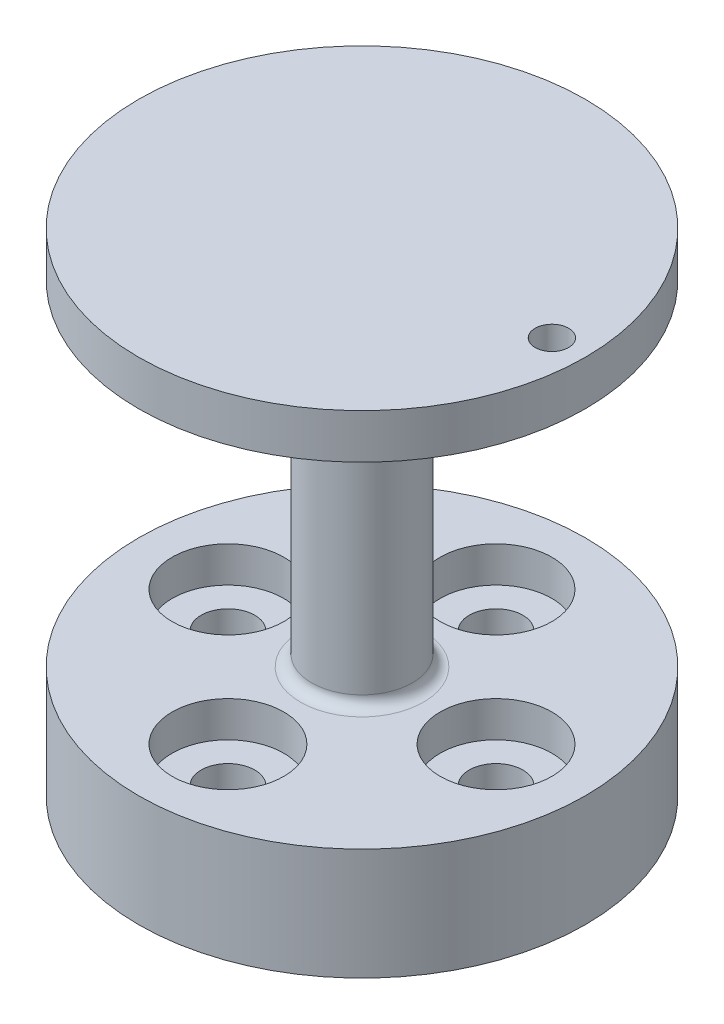
ISO-10303-21;
HEADER;
FILE_DESCRIPTION(('STEP AP214'),'2;1');
FILE_NAME('part.step','',(''),(''),'','','');
FILE_SCHEMA(('AUTOMOTIVE_DESIGN { 1 0 10303 214 1 1 1 1 }'));
ENDSEC;
DATA;
#1=APPLICATION_CONTEXT('core data for automotive mechanical design processes');
#2=APPLICATION_PROTOCOL_DEFINITION('international standard','automotive_design',2000,#1);
#3=PRODUCT_CONTEXT('',#1,'mechanical');
#4=PRODUCT('Part','Part','',(#3));
#5=PRODUCT_RELATED_PRODUCT_CATEGORY('part','',(#4));
#6=PRODUCT_DEFINITION_FORMATION('','',#4);
#7=PRODUCT_DEFINITION_CONTEXT('part definition',#1,'design');
#8=PRODUCT_DEFINITION('design','',#6,#7);
#9=PRODUCT_DEFINITION_SHAPE('','',#8);
#10=(LENGTH_UNIT() NAMED_UNIT(*) SI_UNIT(.MILLI.,.METRE.));
#11=(NAMED_UNIT(*) PLANE_ANGLE_UNIT() SI_UNIT($,.RADIAN.));
#12=(NAMED_UNIT(*) SI_UNIT($,.STERADIAN.) SOLID_ANGLE_UNIT());
#13=UNCERTAINTY_MEASURE_WITH_UNIT(LENGTH_MEASURE(1.E-05),#10,'distance_accuracy_value','');
#14=(GEOMETRIC_REPRESENTATION_CONTEXT(3) GLOBAL_UNCERTAINTY_ASSIGNED_CONTEXT((#13)) GLOBAL_UNIT_ASSIGNED_CONTEXT((#10,
#11,#12)) REPRESENTATION_CONTEXT('',''));
#15=CARTESIAN_POINT('',(0.,0.,0.));
#16=DIRECTION('',(0.,0.,1.));
#17=DIRECTION('',(1.,0.,0.));
#18=AXIS2_PLACEMENT_3D('',#15,#16,#17);
#19=CARTESIAN_POINT('',(0.,5.,0.));
#20=DIRECTION('',(0.,-1.,0.));
#21=DIRECTION('',(0.,0.,-1.));
#22=AXIS2_PLACEMENT_3D('',#19,#20,#21);
#23=CYLINDRICAL_SURFACE('',#22,10.);
#24=CARTESIAN_POINT('',(0.,5.,0.));
#25=DIRECTION('',(0.,1.,0.));
#26=DIRECTION('',(0.,0.,1.));
#27=AXIS2_PLACEMENT_3D('',#24,#25,#26);
#28=CIRCLE('',#27,10.);
#29=CARTESIAN_POINT('',(0.,5.,10.));
#30=VERTEX_POINT('',#29);
#31=EDGE_CURVE('E67',#30,#30,#28,.T.);
#32=ORIENTED_EDGE('',*,*,#31,.F.);
#33=EDGE_LOOP('',(#32));
#34=FACE_BOUND('',#33,.T.);
#35=CARTESIAN_POINT('',(0.,0.,0.));
#36=DIRECTION('',(0.,1.,0.));
#37=DIRECTION('',(0.,0.,1.));
#38=AXIS2_PLACEMENT_3D('',#35,#36,#37);
#39=CIRCLE('',#38,10.);
#40=CARTESIAN_POINT('',(0.,0.,10.));
#41=VERTEX_POINT('',#40);
#42=EDGE_CURVE('E68',#41,#41,#39,.T.);
#43=ORIENTED_EDGE('',*,*,#42,.T.);
#44=EDGE_LOOP('',(#43));
#45=FACE_BOUND('',#44,.T.);
#46=ADVANCED_FACE('F43',(#34,#45),#23,.T.);
#47=CARTESIAN_POINT('',(0.,5.,0.));
#48=DIRECTION('',(0.,1.,0.));
#49=DIRECTION('',(0.,0.,1.));
#50=AXIS2_PLACEMENT_3D('',#47,#48,#49);
#51=PLANE('',#50);
#52=CARTESIAN_POINT('',(0.,5.,0.));
#53=DIRECTION('',(0.,1.,0.));
#54=DIRECTION('',(0.,0.,1.));
#55=AXIS2_PLACEMENT_3D('',#52,#53,#54);
#56=CIRCLE('',#55,2.75);
#57=CARTESIAN_POINT('',(0.,5.,2.75));
#58=VERTEX_POINT('',#57);
#59=EDGE_CURVE('E56',#58,#58,#56,.F.);
#60=ORIENTED_EDGE('',*,*,#59,.T.);
#61=EDGE_LOOP('',(#60));
#62=FACE_BOUND('',#61,.T.);
#63=CARTESIAN_POINT('',(0.,5.,6.));
#64=DIRECTION('',(0.,1.,0.));
#65=DIRECTION('',(0.,0.,1.));
#66=AXIS2_PLACEMENT_3D('',#63,#64,#65);
#67=CIRCLE('',#66,2.5);
#68=CARTESIAN_POINT('',(0.,5.,8.5));
#69=VERTEX_POINT('',#68);
#70=EDGE_CURVE('E135',#69,#69,#67,.T.);
#71=ORIENTED_EDGE('',*,*,#70,.F.);
#72=EDGE_LOOP('',(#71));
#73=FACE_BOUND('',#72,.T.);
#74=CARTESIAN_POINT('',(-6.,5.,0.));
#75=DIRECTION('',(0.,1.,0.));
#76=DIRECTION('',(0.,0.,1.));
#77=AXIS2_PLACEMENT_3D('',#74,#75,#76);
#78=CIRCLE('',#77,2.5);
#79=CARTESIAN_POINT('',(-6.,5.,2.5));
#80=VERTEX_POINT('',#79);
#81=EDGE_CURVE('E119',#80,#80,#78,.T.);
#82=ORIENTED_EDGE('',*,*,#81,.F.);
#83=EDGE_LOOP('',(#82));
#84=FACE_BOUND('',#83,.T.);
#85=CARTESIAN_POINT('',(0.,5.,-6.));
#86=DIRECTION('',(0.,1.,0.));
#87=DIRECTION('',(0.,0.,1.));
#88=AXIS2_PLACEMENT_3D('',#85,#86,#87);
#89=CIRCLE('',#88,2.5);
#90=CARTESIAN_POINT('',(0.,5.,-3.5));
#91=VERTEX_POINT('',#90);
#92=EDGE_CURVE('E103',#91,#91,#89,.T.);
#93=ORIENTED_EDGE('',*,*,#92,.F.);
#94=EDGE_LOOP('',(#93));
#95=FACE_BOUND('',#94,.T.);
#96=CARTESIAN_POINT('',(6.,5.,0.));
#97=DIRECTION('',(0.,1.,0.));
#98=DIRECTION('',(0.,0.,1.));
#99=AXIS2_PLACEMENT_3D('',#96,#97,#98);
#100=CIRCLE('',#99,2.5);
#101=CARTESIAN_POINT('',(6.,5.,2.5));
#102=VERTEX_POINT('',#101);
#103=EDGE_CURVE('E87',#102,#102,#100,.T.);
#104=ORIENTED_EDGE('',*,*,#103,.F.);
#105=EDGE_LOOP('',(#104));
#106=FACE_BOUND('',#105,.T.);
#107=ORIENTED_EDGE('',*,*,#31,.T.);
#108=EDGE_LOOP('',(#107));
#109=FACE_BOUND('',#108,.T.);
#110=ADVANCED_FACE('F183',(#62,#73,#84,#95,#106,#109),#51,.T.);
#111=CARTESIAN_POINT('',(0.,0.,0.));
#112=DIRECTION('',(0.,1.,0.));
#113=DIRECTION('',(0.,0.,1.));
#114=AXIS2_PLACEMENT_3D('',#111,#112,#113);
#115=PLANE('',#114);
#116=CARTESIAN_POINT('',(0.,0.,6.));
#117=DIRECTION('',(0.,1.,0.));
#118=DIRECTION('',(0.,0.,1.));
#119=AXIS2_PLACEMENT_3D('',#116,#117,#118);
#120=CIRCLE('',#119,1.2);
#121=CARTESIAN_POINT('',(0.,0.,7.2));
#122=VERTEX_POINT('',#121);
#123=EDGE_CURVE('E123',#122,#122,#120,.T.);
#124=ORIENTED_EDGE('',*,*,#123,.T.);
#125=EDGE_LOOP('',(#124));
#126=FACE_BOUND('',#125,.T.);
#127=CARTESIAN_POINT('',(-6.,0.,0.));
#128=DIRECTION('',(0.,1.,0.));
#129=DIRECTION('',(0.,0.,1.));
#130=AXIS2_PLACEMENT_3D('',#127,#128,#129);
#131=CIRCLE('',#130,1.2);
#132=CARTESIAN_POINT('',(-6.,0.,1.2));
#133=VERTEX_POINT('',#132);
#134=EDGE_CURVE('E107',#133,#133,#131,.T.);
#135=ORIENTED_EDGE('',*,*,#134,.T.);
#136=EDGE_LOOP('',(#135));
#137=FACE_BOUND('',#136,.T.);
#138=CARTESIAN_POINT('',(0.,0.,-6.));
#139=DIRECTION('',(0.,1.,0.));
#140=DIRECTION('',(0.,0.,1.));
#141=AXIS2_PLACEMENT_3D('',#138,#139,#140);
#142=CIRCLE('',#141,1.2);
#143=CARTESIAN_POINT('',(0.,0.,-4.8));
#144=VERTEX_POINT('',#143);
#145=EDGE_CURVE('E91',#144,#144,#142,.T.);
#146=ORIENTED_EDGE('',*,*,#145,.T.);
#147=EDGE_LOOP('',(#146));
#148=FACE_BOUND('',#147,.T.);
#149=CARTESIAN_POINT('',(6.,0.,0.));
#150=DIRECTION('',(0.,1.,0.));
#151=DIRECTION('',(0.,0.,1.));
#152=AXIS2_PLACEMENT_3D('',#149,#150,#151);
#153=CIRCLE('',#152,1.2);
#154=CARTESIAN_POINT('',(6.,0.,1.2));
#155=VERTEX_POINT('',#154);
#156=EDGE_CURVE('E72',#155,#155,#153,.T.);
#157=ORIENTED_EDGE('',*,*,#156,.T.);
#158=EDGE_LOOP('',(#157));
#159=FACE_BOUND('',#158,.T.);
#160=ORIENTED_EDGE('',*,*,#42,.F.);
#161=EDGE_LOOP('',(#160));
#162=FACE_BOUND('',#161,.T.);
#163=ADVANCED_FACE('F190',(#126,#137,#148,#159,#162),#115,.F.);
#164=CARTESIAN_POINT('',(6.,5.,0.));
#165=DIRECTION('',(0.,1.,0.));
#166=DIRECTION('',(0.,0.,1.));
#167=AXIS2_PLACEMENT_3D('',#164,#165,#166);
#168=CYLINDRICAL_SURFACE('',#167,1.2);
#169=ORIENTED_EDGE('',*,*,#156,.F.);
#170=EDGE_LOOP('',(#169));
#171=FACE_BOUND('',#170,.T.);
#172=CARTESIAN_POINT('',(6.,3.4,0.));
#173=DIRECTION('',(0.,1.,0.));
#174=DIRECTION('',(0.,0.,1.));
#175=AXIS2_PLACEMENT_3D('',#172,#173,#174);
#176=CIRCLE('',#175,1.2);
#177=CARTESIAN_POINT('',(6.,3.4,1.2));
#178=VERTEX_POINT('',#177);
#179=EDGE_CURVE('E79',#178,#178,#176,.T.);
#180=ORIENTED_EDGE('',*,*,#179,.T.);
#181=EDGE_LOOP('',(#180));
#182=FACE_BOUND('',#181,.T.);
#183=ADVANCED_FACE('F227',(#171,#182),#168,.F.);
#184=CARTESIAN_POINT('',(7.2,3.4,0.));
#185=DIRECTION('',(0.,-1.,0.));
#186=DIRECTION('',(0.,0.,-1.));
#187=AXIS2_PLACEMENT_3D('',#184,#185,#186);
#188=PLANE('',#187);
#189=ORIENTED_EDGE('',*,*,#179,.F.);
#190=EDGE_LOOP('',(#189));
#191=FACE_BOUND('',#190,.T.);
#192=CARTESIAN_POINT('',(6.,3.4,0.));
#193=DIRECTION('',(0.,1.,0.));
#194=DIRECTION('',(0.,0.,1.));
#195=AXIS2_PLACEMENT_3D('',#192,#193,#194);
#196=CIRCLE('',#195,2.5);
#197=CARTESIAN_POINT('',(6.,3.4,2.5));
#198=VERTEX_POINT('',#197);
#199=EDGE_CURVE('E83',#198,#198,#196,.T.);
#200=ORIENTED_EDGE('',*,*,#199,.T.);
#201=EDGE_LOOP('',(#200));
#202=FACE_BOUND('',#201,.T.);
#203=ADVANCED_FACE('F220',(#191,#202),#188,.F.);
#204=CARTESIAN_POINT('',(6.,5.,0.));
#205=DIRECTION('',(0.,1.,0.));
#206=DIRECTION('',(0.,0.,1.));
#207=AXIS2_PLACEMENT_3D('',#204,#205,#206);
#208=CYLINDRICAL_SURFACE('',#207,2.5);
#209=ORIENTED_EDGE('',*,*,#199,.F.);
#210=EDGE_LOOP('',(#209));
#211=FACE_BOUND('',#210,.T.);
#212=ORIENTED_EDGE('',*,*,#103,.T.);
#213=EDGE_LOOP('',(#212));
#214=FACE_BOUND('',#213,.T.);
#215=ADVANCED_FACE('F211',(#211,#214),#208,.F.);
#216=CARTESIAN_POINT('',(0.,20.,0.));
#217=DIRECTION('',(0.,-1.,0.));
#218=DIRECTION('',(0.,0.,-1.));
#219=AXIS2_PLACEMENT_3D('',#216,#217,#218);
#220=CYLINDRICAL_SURFACE('',#219,2.25);
#221=CARTESIAN_POINT('',(0.,15.,0.));
#222=DIRECTION('',(0.,1.,0.));
#223=DIRECTION('',(0.,0.,1.));
#224=AXIS2_PLACEMENT_3D('',#221,#222,#223);
#225=CIRCLE('',#224,2.25);
#226=CARTESIAN_POINT('',(0.,15.,2.25));
#227=VERTEX_POINT('',#226);
#228=EDGE_CURVE('E10',#227,#227,#225,.F.);
#229=ORIENTED_EDGE('',*,*,#228,.T.);
#230=EDGE_LOOP('',(#229));
#231=FACE_BOUND('',#230,.T.);
#232=CARTESIAN_POINT('',(0.,5.5,0.));
#233=DIRECTION('',(0.,1.,0.));
#234=DIRECTION('',(0.,0.,1.));
#235=AXIS2_PLACEMENT_3D('',#232,#233,#234);
#236=CIRCLE('',#235,2.25);
#237=CARTESIAN_POINT('',(0.,5.5,2.25));
#238=VERTEX_POINT('',#237);
#239=EDGE_CURVE('E61',#238,#238,#236,.T.);
#240=ORIENTED_EDGE('',*,*,#239,.T.);
#241=EDGE_LOOP('',(#240));
#242=FACE_BOUND('',#241,.T.);
#243=ADVANCED_FACE('F209',(#231,#242),#220,.T.);
#244=CARTESIAN_POINT('',(0.,5.,-6.));
#245=DIRECTION('',(0.,1.,0.));
#246=DIRECTION('',(0.,0.,1.));
#247=AXIS2_PLACEMENT_3D('',#244,#245,#246);
#248=CYLINDRICAL_SURFACE('',#247,1.2);
#249=ORIENTED_EDGE('',*,*,#145,.F.);
#250=EDGE_LOOP('',(#249));
#251=FACE_BOUND('',#250,.T.);
#252=CARTESIAN_POINT('',(0.,3.4,-6.));
#253=DIRECTION('',(0.,1.,0.));
#254=DIRECTION('',(0.,0.,1.));
#255=AXIS2_PLACEMENT_3D('',#252,#253,#254);
#256=CIRCLE('',#255,1.2);
#257=CARTESIAN_POINT('',(0.,3.4,-4.8));
#258=VERTEX_POINT('',#257);
#259=EDGE_CURVE('E95',#258,#258,#256,.T.);
#260=ORIENTED_EDGE('',*,*,#259,.T.);
#261=EDGE_LOOP('',(#260));
#262=FACE_BOUND('',#261,.T.);
#263=ADVANCED_FACE('F210',(#251,#262),#248,.F.);
#264=CARTESIAN_POINT('',(1.19999999999998,3.4,-6.));
#265=DIRECTION('',(0.,-1.,0.));
#266=DIRECTION('',(0.,0.,-1.));
#267=AXIS2_PLACEMENT_3D('',#264,#265,#266);
#268=PLANE('',#267);
#269=ORIENTED_EDGE('',*,*,#259,.F.);
#270=EDGE_LOOP('',(#269));
#271=FACE_BOUND('',#270,.T.);
#272=CARTESIAN_POINT('',(0.,3.4,-6.));
#273=DIRECTION('',(0.,1.,0.));
#274=DIRECTION('',(0.,0.,1.));
#275=AXIS2_PLACEMENT_3D('',#272,#273,#274);
#276=CIRCLE('',#275,2.5);
#277=CARTESIAN_POINT('',(0.,3.4,-3.5));
#278=VERTEX_POINT('',#277);
#279=EDGE_CURVE('E99',#278,#278,#276,.T.);
#280=ORIENTED_EDGE('',*,*,#279,.T.);
#281=EDGE_LOOP('',(#280));
#282=FACE_BOUND('',#281,.T.);
#283=ADVANCED_FACE('F216',(#271,#282),#268,.F.);
#284=CARTESIAN_POINT('',(0.,5.,-6.));
#285=DIRECTION('',(0.,1.,0.));
#286=DIRECTION('',(0.,0.,1.));
#287=AXIS2_PLACEMENT_3D('',#284,#285,#286);
#288=CYLINDRICAL_SURFACE('',#287,2.5);
#289=ORIENTED_EDGE('',*,*,#279,.F.);
#290=EDGE_LOOP('',(#289));
#291=FACE_BOUND('',#290,.T.);
#292=ORIENTED_EDGE('',*,*,#92,.T.);
#293=EDGE_LOOP('',(#292));
#294=FACE_BOUND('',#293,.T.);
#295=ADVANCED_FACE('F258',(#291,#294),#288,.F.);
#296=CARTESIAN_POINT('',(-6.,5.,0.));
#297=DIRECTION('',(0.,1.,0.));
#298=DIRECTION('',(0.,0.,1.));
#299=AXIS2_PLACEMENT_3D('',#296,#297,#298);
#300=CYLINDRICAL_SURFACE('',#299,1.2);
#301=ORIENTED_EDGE('',*,*,#134,.F.);
#302=EDGE_LOOP('',(#301));
#303=FACE_BOUND('',#302,.T.);
#304=CARTESIAN_POINT('',(-6.,3.4,0.));
#305=DIRECTION('',(0.,1.,0.));
#306=DIRECTION('',(0.,0.,1.));
#307=AXIS2_PLACEMENT_3D('',#304,#305,#306);
#308=CIRCLE('',#307,1.2);
#309=CARTESIAN_POINT('',(-6.,3.4,1.2));
#310=VERTEX_POINT('',#309);
#311=EDGE_CURVE('E111',#310,#310,#308,.T.);
#312=ORIENTED_EDGE('',*,*,#311,.T.);
#313=EDGE_LOOP('',(#312));
#314=FACE_BOUND('',#313,.T.);
#315=ADVANCED_FACE('F263',(#303,#314),#300,.F.);
#316=CARTESIAN_POINT('',(-4.8,3.4,0.));
#317=DIRECTION('',(0.,-1.,0.));
#318=DIRECTION('',(0.,0.,-1.));
#319=AXIS2_PLACEMENT_3D('',#316,#317,#318);
#320=PLANE('',#319);
#321=ORIENTED_EDGE('',*,*,#311,.F.);
#322=EDGE_LOOP('',(#321));
#323=FACE_BOUND('',#322,.T.);
#324=CARTESIAN_POINT('',(-6.,3.4,0.));
#325=DIRECTION('',(0.,1.,0.));
#326=DIRECTION('',(0.,0.,1.));
#327=AXIS2_PLACEMENT_3D('',#324,#325,#326);
#328=CIRCLE('',#327,2.5);
#329=CARTESIAN_POINT('',(-6.,3.4,2.5));
#330=VERTEX_POINT('',#329);
#331=EDGE_CURVE('E115',#330,#330,#328,.T.);
#332=ORIENTED_EDGE('',*,*,#331,.T.);
#333=EDGE_LOOP('',(#332));
#334=FACE_BOUND('',#333,.T.);
#335=ADVANCED_FACE('F270',(#323,#334),#320,.F.);
#336=CARTESIAN_POINT('',(-6.,5.,0.));
#337=DIRECTION('',(0.,1.,0.));
#338=DIRECTION('',(0.,0.,1.));
#339=AXIS2_PLACEMENT_3D('',#336,#337,#338);
#340=CYLINDRICAL_SURFACE('',#339,2.5);
#341=ORIENTED_EDGE('',*,*,#331,.F.);
#342=EDGE_LOOP('',(#341));
#343=FACE_BOUND('',#342,.T.);
#344=ORIENTED_EDGE('',*,*,#81,.T.);
#345=EDGE_LOOP('',(#344));
#346=FACE_BOUND('',#345,.T.);
#347=ADVANCED_FACE('F276',(#343,#346),#340,.F.);
#348=CARTESIAN_POINT('',(0.,5.,6.));
#349=DIRECTION('',(0.,1.,0.));
#350=DIRECTION('',(0.,0.,1.));
#351=AXIS2_PLACEMENT_3D('',#348,#349,#350);
#352=CYLINDRICAL_SURFACE('',#351,1.2);
#353=ORIENTED_EDGE('',*,*,#123,.F.);
#354=EDGE_LOOP('',(#353));
#355=FACE_BOUND('',#354,.T.);
#356=CARTESIAN_POINT('',(0.,3.4,6.));
#357=DIRECTION('',(0.,1.,0.));
#358=DIRECTION('',(0.,0.,1.));
#359=AXIS2_PLACEMENT_3D('',#356,#357,#358);
#360=CIRCLE('',#359,1.2);
#361=CARTESIAN_POINT('',(0.,3.4,7.2));
#362=VERTEX_POINT('',#361);
#363=EDGE_CURVE('E127',#362,#362,#360,.T.);
#364=ORIENTED_EDGE('',*,*,#363,.T.);
#365=EDGE_LOOP('',(#364));
#366=FACE_BOUND('',#365,.T.);
#367=ADVANCED_FACE('F280',(#355,#366),#352,.F.);
#368=CARTESIAN_POINT('',(1.20000000000006,3.4,6.));
#369=DIRECTION('',(0.,-1.,0.));
#370=DIRECTION('',(0.,0.,-1.));
#371=AXIS2_PLACEMENT_3D('',#368,#369,#370);
#372=PLANE('',#371);
#373=ORIENTED_EDGE('',*,*,#363,.F.);
#374=EDGE_LOOP('',(#373));
#375=FACE_BOUND('',#374,.T.);
#376=CARTESIAN_POINT('',(0.,3.4,6.));
#377=DIRECTION('',(0.,1.,0.));
#378=DIRECTION('',(0.,0.,1.));
#379=AXIS2_PLACEMENT_3D('',#376,#377,#378);
#380=CIRCLE('',#379,2.5);
#381=CARTESIAN_POINT('',(0.,3.4,8.5));
#382=VERTEX_POINT('',#381);
#383=EDGE_CURVE('E131',#382,#382,#380,.T.);
#384=ORIENTED_EDGE('',*,*,#383,.T.);
#385=EDGE_LOOP('',(#384));
#386=FACE_BOUND('',#385,.T.);
#387=ADVANCED_FACE('F202',(#375,#386),#372,.F.);
#388=CARTESIAN_POINT('',(0.,5.,6.));
#389=DIRECTION('',(0.,1.,0.));
#390=DIRECTION('',(0.,0.,1.));
#391=AXIS2_PLACEMENT_3D('',#388,#389,#390);
#392=CYLINDRICAL_SURFACE('',#391,2.5);
#393=ORIENTED_EDGE('',*,*,#383,.F.);
#394=EDGE_LOOP('',(#393));
#395=FACE_BOUND('',#394,.T.);
#396=ORIENTED_EDGE('',*,*,#70,.T.);
#397=EDGE_LOOP('',(#396));
#398=FACE_BOUND('',#397,.T.);
#399=ADVANCED_FACE('F197',(#395,#398),#392,.F.);
#400=CARTESIAN_POINT('',(0.,5.5,0.));
#401=DIRECTION('',(0.,1.,0.));
#402=DIRECTION('',(0.,0.,1.));
#403=AXIS2_PLACEMENT_3D('',#400,#401,#402);
#404=TOROIDAL_SURFACE('',#403,2.75,0.5);
#405=ORIENTED_EDGE('',*,*,#59,.F.);
#406=EDGE_LOOP('',(#405));
#407=FACE_BOUND('',#406,.T.);
#408=ORIENTED_EDGE('',*,*,#239,.F.);
#409=EDGE_LOOP('',(#408));
#410=FACE_BOUND('',#409,.T.);
#411=ADVANCED_FACE('F168',(#407,#410),#404,.F.);
#412=CARTESIAN_POINT('',(0.,22.,0.));
#413=DIRECTION('',(0.,-1.,0.));
#414=DIRECTION('',(0.,0.,-1.));
#415=AXIS2_PLACEMENT_3D('',#412,#413,#414);
#416=CYLINDRICAL_SURFACE('',#415,10.);
#417=CARTESIAN_POINT('',(0.,22.,0.));
#418=DIRECTION('',(0.,1.,0.));
#419=DIRECTION('',(0.,0.,1.));
#420=AXIS2_PLACEMENT_3D('',#417,#418,#419);
#421=CIRCLE('',#420,10.);
#422=CARTESIAN_POINT('',(0.,22.,10.));
#423=VERTEX_POINT('',#422);
#424=EDGE_CURVE('E139',#423,#423,#421,.T.);
#425=ORIENTED_EDGE('',*,*,#424,.F.);
#426=EDGE_LOOP('',(#425));
#427=FACE_BOUND('',#426,.T.);
#428=CARTESIAN_POINT('',(0.,20.,0.));
#429=DIRECTION('',(0.,1.,0.));
#430=DIRECTION('',(0.,0.,1.));
#431=AXIS2_PLACEMENT_3D('',#428,#429,#430);
#432=CIRCLE('',#431,10.);
#433=CARTESIAN_POINT('',(0.,20.,10.));
#434=VERTEX_POINT('',#433);
#435=EDGE_CURVE('E140',#434,#434,#432,.T.);
#436=ORIENTED_EDGE('',*,*,#435,.T.);
#437=EDGE_LOOP('',(#436));
#438=FACE_BOUND('',#437,.T.);
#439=ADVANCED_FACE('F162',(#427,#438),#416,.T.);
#440=CARTESIAN_POINT('',(0.,22.,0.));
#441=DIRECTION('',(0.,1.,0.));
#442=DIRECTION('',(0.,0.,1.));
#443=AXIS2_PLACEMENT_3D('',#440,#441,#442);
#444=PLANE('',#443);
#445=CARTESIAN_POINT('',(8.5,22.,0.));
#446=DIRECTION('',(0.,1.,0.));
#447=DIRECTION('',(0.,0.,1.));
#448=AXIS2_PLACEMENT_3D('',#445,#446,#447);
#449=CIRCLE('',#448,0.75);
#450=CARTESIAN_POINT('',(8.5,22.,0.75));
#451=VERTEX_POINT('',#450);
#452=EDGE_CURVE('E151',#451,#451,#449,.T.);
#453=ORIENTED_EDGE('',*,*,#452,.F.);
#454=EDGE_LOOP('',(#453));
#455=FACE_BOUND('',#454,.T.);
#456=ORIENTED_EDGE('',*,*,#424,.T.);
#457=EDGE_LOOP('',(#456));
#458=FACE_BOUND('',#457,.T.);
#459=ADVANCED_FACE('F158',(#455,#458),#444,.T.);
#460=CARTESIAN_POINT('',(0.,20.,0.));
#461=DIRECTION('',(0.,1.,0.));
#462=DIRECTION('',(0.,0.,1.));
#463=AXIS2_PLACEMENT_3D('',#460,#461,#462);
#464=PLANE('',#463);
#465=CARTESIAN_POINT('',(0.,20.,0.));
#466=DIRECTION('',(0.,1.,0.));
#467=DIRECTION('',(0.,0.,1.));
#468=AXIS2_PLACEMENT_3D('',#465,#466,#467);
#469=CIRCLE('',#468,7.25);
#470=CARTESIAN_POINT('',(0.,20.,7.25));
#471=VERTEX_POINT('',#470);
#472=EDGE_CURVE('E51',#471,#471,#469,.T.);
#473=ORIENTED_EDGE('',*,*,#472,.T.);
#474=EDGE_LOOP('',(#473));
#475=FACE_BOUND('',#474,.T.);
#476=CARTESIAN_POINT('',(8.5,20.,0.));
#477=DIRECTION('',(0.,1.,0.));
#478=DIRECTION('',(0.,0.,1.));
#479=AXIS2_PLACEMENT_3D('',#476,#477,#478);
#480=CIRCLE('',#479,0.75);
#481=CARTESIAN_POINT('',(8.5,20.,0.75));
#482=VERTEX_POINT('',#481);
#483=EDGE_CURVE('E144',#482,#482,#480,.F.);
#484=ORIENTED_EDGE('',*,*,#483,.F.);
#485=EDGE_LOOP('',(#484));
#486=FACE_BOUND('',#485,.T.);
#487=ORIENTED_EDGE('',*,*,#435,.F.);
#488=EDGE_LOOP('',(#487));
#489=FACE_BOUND('',#488,.T.);
#490=ADVANCED_FACE('F161',(#475,#486,#489),#464,.F.);
#491=CARTESIAN_POINT('',(8.5,17.8786796564404,0.));
#492=DIRECTION('',(0.,1.,0.));
#493=DIRECTION('',(0.,0.,1.));
#494=AXIS2_PLACEMENT_3D('',#491,#492,#493);
#495=CYLINDRICAL_SURFACE('',#494,0.75);
#496=ORIENTED_EDGE('',*,*,#483,.T.);
#497=EDGE_LOOP('',(#496));
#498=FACE_BOUND('',#497,.T.);
#499=ORIENTED_EDGE('',*,*,#452,.T.);
#500=EDGE_LOOP('',(#499));
#501=FACE_BOUND('',#500,.T.);
#502=ADVANCED_FACE('F156',(#498,#501),#495,.F.);
#503=CARTESIAN_POINT('',(0.,15.,0.));
#504=DIRECTION('',(0.,1.,0.));
#505=DIRECTION('',(0.,0.,1.));
#506=AXIS2_PLACEMENT_3D('',#503,#504,#505);
#507=TOROIDAL_SURFACE('',#506,7.25,5.);
#508=ORIENTED_EDGE('',*,*,#228,.F.);
#509=EDGE_LOOP('',(#508));
#510=FACE_BOUND('',#509,.T.);
#511=ORIENTED_EDGE('',*,*,#472,.F.);
#512=EDGE_LOOP('',(#511));
#513=FACE_BOUND('',#512,.T.);
#514=ADVANCED_FACE('F45',(#510,#513),#507,.F.);
#515=CLOSED_SHELL('',(#46,#110,#163,#183,#203,#215,#243,#263,#283,#295,#315,#335,#347,#367,#387,
#399,#411,#439,#459,#490,#502,#514));
#516=MANIFOLD_SOLID_BREP('B2',#515);
#517=ADVANCED_BREP_SHAPE_REPRESENTATION('',(#18,#516),#14);
#518=SHAPE_DEFINITION_REPRESENTATION(#9,#517);
ENDSEC;
END-ISO-10303-21;
